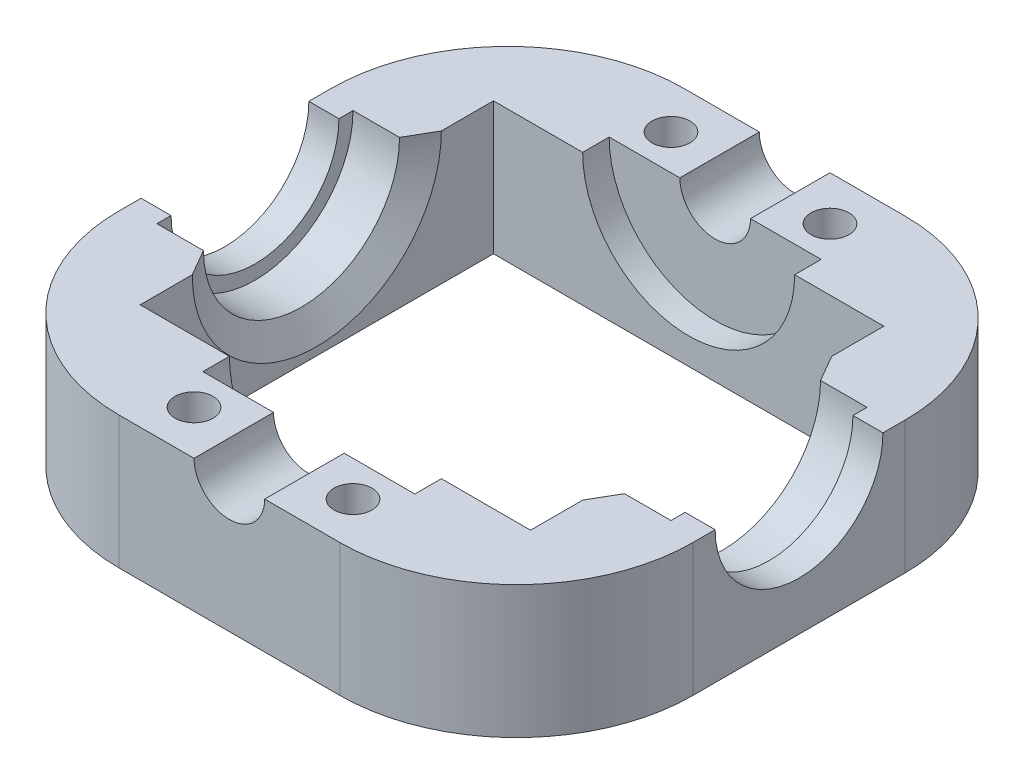
ISO-10303-21;
HEADER;
FILE_DESCRIPTION(('STEP AP214'),'2;1');
FILE_NAME('part.step','',(''),(''),'','','');
FILE_SCHEMA(('AUTOMOTIVE_DESIGN { 1 0 10303 214 1 1 1 1 }'));
ENDSEC;
DATA;
#1=APPLICATION_CONTEXT('core data for automotive mechanical design processes');
#2=APPLICATION_PROTOCOL_DEFINITION('international standard','automotive_design',2000,#1);
#3=PRODUCT_CONTEXT('',#1,'mechanical');
#4=PRODUCT('Part','Part','',(#3));
#5=PRODUCT_RELATED_PRODUCT_CATEGORY('part','',(#4));
#6=PRODUCT_DEFINITION_FORMATION('','',#4);
#7=PRODUCT_DEFINITION_CONTEXT('part definition',#1,'design');
#8=PRODUCT_DEFINITION('design','',#6,#7);
#9=PRODUCT_DEFINITION_SHAPE('','',#8);
#10=(LENGTH_UNIT() NAMED_UNIT(*) SI_UNIT(.MILLI.,.METRE.));
#11=(NAMED_UNIT(*) PLANE_ANGLE_UNIT() SI_UNIT($,.RADIAN.));
#12=(NAMED_UNIT(*) SI_UNIT($,.STERADIAN.) SOLID_ANGLE_UNIT());
#13=UNCERTAINTY_MEASURE_WITH_UNIT(LENGTH_MEASURE(1.E-05),#10,'distance_accuracy_value','');
#14=(GEOMETRIC_REPRESENTATION_CONTEXT(3) GLOBAL_UNCERTAINTY_ASSIGNED_CONTEXT((#13)) GLOBAL_UNIT_ASSIGNED_CONTEXT((#10,
#11,#12)) REPRESENTATION_CONTEXT('',''));
#15=CARTESIAN_POINT('',(0.,0.,0.));
#16=DIRECTION('',(0.,0.,1.));
#17=DIRECTION('',(1.,0.,0.));
#18=AXIS2_PLACEMENT_3D('',#15,#16,#17);
#19=CARTESIAN_POINT('',(0.,15.,0.));
#20=DIRECTION('',(0.,1.,0.));
#21=DIRECTION('',(0.,0.,1.));
#22=AXIS2_PLACEMENT_3D('',#19,#20,#21);
#23=PLANE('',#22);
#24=DIRECTION('',(1.,0.,0.));
#25=VECTOR('',#24,1.);
#26=CARTESIAN_POINT('',(0.,15.,23.));
#27=LINE('',#26,#25);
#28=CARTESIAN_POINT('',(-12.,15.,23.));
#29=VERTEX_POINT('',#28);
#30=CARTESIAN_POINT('',(-4.,15.,23.));
#31=VERTEX_POINT('',#30);
#32=EDGE_CURVE('E57',#29,#31,#27,.T.);
#33=ORIENTED_EDGE('',*,*,#32,.F.);
#34=DIRECTION('',(0.,0.,-1.));
#35=VECTOR('',#34,1.);
#36=CARTESIAN_POINT('',(-12.,15.,-29.8714158950038));
#37=LINE('',#36,#35);
#38=CARTESIAN_POINT('',(-12.,15.,20.));
#39=VERTEX_POINT('',#38);
#40=EDGE_CURVE('E265',#39,#29,#37,.F.);
#41=ORIENTED_EDGE('',*,*,#40,.F.);
#42=DIRECTION('',(1.,0.,0.));
#43=VECTOR('',#42,1.);
#44=CARTESIAN_POINT('',(22.1,15.,20.));
#45=LINE('',#44,#43);
#46=CARTESIAN_POINT('',(-22.1,15.,20.));
#47=VERTEX_POINT('',#46);
#48=EDGE_CURVE('E342',#47,#39,#45,.T.);
#49=ORIENTED_EDGE('',*,*,#48,.F.);
#50=DIRECTION('',(0.,0.,1.));
#51=VECTOR('',#50,1.);
#52=CARTESIAN_POINT('',(-22.1,15.,20.));
#53=LINE('',#52,#51);
#54=CARTESIAN_POINT('',(-22.1,15.,14.1));
#55=VERTEX_POINT('',#54);
#56=EDGE_CURVE('E341',#55,#47,#53,.T.);
#57=ORIENTED_EDGE('',*,*,#56,.F.);
#58=DIRECTION('',(0.499999999999998,0.,0.86602540378444));
#59=VECTOR('',#58,1.);
#60=CARTESIAN_POINT('',(-30.2406387955737,15.,0.));
#61=LINE('',#60,#59);
#62=CARTESIAN_POINT('',(-23.8320508075689,15.,11.1));
#63=VERTEX_POINT('',#62);
#64=EDGE_CURVE('E462',#55,#63,#61,.F.);
#65=ORIENTED_EDGE('',*,*,#64,.T.);
#66=DIRECTION('',(-1.,0.,0.));
#67=VECTOR('',#66,1.);
#68=CARTESIAN_POINT('',(22.1,15.,11.1));
#69=LINE('',#68,#67);
#70=CARTESIAN_POINT('',(-29.0999999999999,15.,11.1));
#71=VERTEX_POINT('',#70);
#72=EDGE_CURVE('E323',#71,#63,#69,.F.);
#73=ORIENTED_EDGE('',*,*,#72,.F.);
#74=DIRECTION('',(0.,0.,1.));
#75=VECTOR('',#74,1.);
#76=CARTESIAN_POINT('',(-29.0999999999999,15.,0.));
#77=LINE('',#76,#75);
#78=CARTESIAN_POINT('',(-29.0999999999999,15.,9.5));
#79=VERTEX_POINT('',#78);
#80=EDGE_CURVE('E403',#79,#71,#77,.T.);
#81=ORIENTED_EDGE('',*,*,#80,.F.);
#82=DIRECTION('',(1.,0.,0.));
#83=VECTOR('',#82,1.);
#84=CARTESIAN_POINT('',(-32.5,15.,9.5));
#85=LINE('',#84,#83);
#86=CARTESIAN_POINT('',(-32.5,15.,9.5));
#87=VERTEX_POINT('',#86);
#88=EDGE_CURVE('E313',#87,#79,#85,.T.);
#89=ORIENTED_EDGE('',*,*,#88,.F.);
#90=DIRECTION('',(0.,0.,1.));
#91=VECTOR('',#90,1.);
#92=CARTESIAN_POINT('',(-32.5,15.,32.));
#93=LINE('',#92,#91);
#94=CARTESIAN_POINT('',(-32.5,15.,12.));
#95=VERTEX_POINT('',#94);
#96=EDGE_CURVE('E377',#87,#95,#93,.T.);
#97=ORIENTED_EDGE('',*,*,#96,.T.);
#98=CARTESIAN_POINT('',(-12.5,15.,12.));
#99=DIRECTION('',(0.,1.,0.));
#100=DIRECTION('',(0.,0.,1.));
#101=AXIS2_PLACEMENT_3D('',#98,#99,#100);
#102=CIRCLE('',#101,20.);
#103=CARTESIAN_POINT('',(-12.5,15.,32.));
#104=VERTEX_POINT('',#103);
#105=EDGE_CURVE('E428',#95,#104,#102,.T.);
#106=ORIENTED_EDGE('',*,*,#105,.T.);
#107=DIRECTION('',(1.,0.,0.));
#108=VECTOR('',#107,1.);
#109=CARTESIAN_POINT('',(32.5,15.,32.));
#110=LINE('',#109,#108);
#111=CARTESIAN_POINT('',(-4.,15.,32.));
#112=VERTEX_POINT('',#111);
#113=EDGE_CURVE('E378',#104,#112,#110,.T.);
#114=ORIENTED_EDGE('',*,*,#113,.T.);
#115=DIRECTION('',(0.,0.,1.));
#116=VECTOR('',#115,1.);
#117=CARTESIAN_POINT('',(-4.,15.,-32.));
#118=LINE('',#117,#116);
#119=EDGE_CURVE('E303',#31,#112,#118,.T.);
#120=ORIENTED_EDGE('',*,*,#119,.F.);
#121=EDGE_LOOP('',(#33,#41,#49,#57,#65,#73,#81,#89,#97,#106,#114,#120));
#122=FACE_BOUND('',#121,.T.);
#123=CARTESIAN_POINT('',(-8.99999999999999,15.,27.));
#124=DIRECTION('',(0.,1.,0.));
#125=DIRECTION('',(0.,0.,1.));
#126=AXIS2_PLACEMENT_3D('',#123,#124,#125);
#127=CIRCLE('',#126,2.15);
#128=CARTESIAN_POINT('',(-8.99999999999999,15.,29.15));
#129=VERTEX_POINT('',#128);
#130=EDGE_CURVE('E278',#129,#129,#127,.T.);
#131=ORIENTED_EDGE('',*,*,#130,.F.);
#132=EDGE_LOOP('',(#131));
#133=FACE_BOUND('',#132,.T.);
#134=ADVANCED_FACE('F35',(#122,#133),#23,.T.);
#135=DIRECTION('',(0.,0.,-1.));
#136=VECTOR('',#135,1.);
#137=CARTESIAN_POINT('',(-12.,15.,-29.8714158950038));
#138=LINE('',#137,#136);
#139=CARTESIAN_POINT('',(-12.,15.,-23.));
#140=VERTEX_POINT('',#139);
#141=CARTESIAN_POINT('',(-12.,15.,-20.));
#142=VERTEX_POINT('',#141);
#143=EDGE_CURVE('E243',#140,#142,#138,.F.);
#144=ORIENTED_EDGE('',*,*,#143,.F.);
#145=DIRECTION('',(-1.,0.,0.));
#146=VECTOR('',#145,1.);
#147=CARTESIAN_POINT('',(0.,15.,-23.));
#148=LINE('',#147,#146);
#149=CARTESIAN_POINT('',(-4.,15.,-23.));
#150=VERTEX_POINT('',#149);
#151=EDGE_CURVE('E231',#150,#140,#148,.T.);
#152=ORIENTED_EDGE('',*,*,#151,.F.);
#153=DIRECTION('',(0.,0.,1.));
#154=VECTOR('',#153,1.);
#155=CARTESIAN_POINT('',(-4.,15.,-32.));
#156=LINE('',#155,#154);
#157=CARTESIAN_POINT('',(-4.,15.,-32.));
#158=VERTEX_POINT('',#157);
#159=EDGE_CURVE('E298',#158,#150,#156,.T.);
#160=ORIENTED_EDGE('',*,*,#159,.F.);
#161=DIRECTION('',(-1.,0.,0.));
#162=VECTOR('',#161,1.);
#163=CARTESIAN_POINT('',(32.5,15.,-32.));
#164=LINE('',#163,#162);
#165=CARTESIAN_POINT('',(-12.5,15.,-32.));
#166=VERTEX_POINT('',#165);
#167=EDGE_CURVE('E384',#158,#166,#164,.T.);
#168=ORIENTED_EDGE('',*,*,#167,.T.);
#169=CARTESIAN_POINT('',(-12.5,15.,-12.));
#170=DIRECTION('',(0.,1.,0.));
#171=DIRECTION('',(0.,0.,1.));
#172=AXIS2_PLACEMENT_3D('',#169,#170,#171);
#173=CIRCLE('',#172,20.);
#174=CARTESIAN_POINT('',(-32.5,15.,-12.));
#175=VERTEX_POINT('',#174);
#176=EDGE_CURVE('E435',#166,#175,#173,.T.);
#177=ORIENTED_EDGE('',*,*,#176,.T.);
#178=CARTESIAN_POINT('',(-32.5,15.,-9.5));
#179=VERTEX_POINT('',#178);
#180=EDGE_CURVE('E374',#175,#179,#93,.T.);
#181=ORIENTED_EDGE('',*,*,#180,.T.);
#182=DIRECTION('',(1.,0.,0.));
#183=VECTOR('',#182,1.);
#184=CARTESIAN_POINT('',(-32.5,15.,-9.5));
#185=LINE('',#184,#183);
#186=CARTESIAN_POINT('',(-29.0999999999999,15.,-9.5));
#187=VERTEX_POINT('',#186);
#188=EDGE_CURVE('E309',#187,#179,#185,.F.);
#189=ORIENTED_EDGE('',*,*,#188,.F.);
#190=CARTESIAN_POINT('',(-29.0999999999999,15.,-11.1));
#191=VERTEX_POINT('',#190);
#192=EDGE_CURVE('E404',#191,#187,#77,.T.);
#193=ORIENTED_EDGE('',*,*,#192,.F.);
#194=DIRECTION('',(-1.,0.,0.));
#195=VECTOR('',#194,1.);
#196=CARTESIAN_POINT('',(22.1,15.,-11.1));
#197=LINE('',#196,#195);
#198=CARTESIAN_POINT('',(-23.8320508075689,15.,-11.1));
#199=VERTEX_POINT('',#198);
#200=EDGE_CURVE('E326',#199,#191,#197,.T.);
#201=ORIENTED_EDGE('',*,*,#200,.F.);
#202=DIRECTION('',(-0.499999999999998,0.,0.86602540378444));
#203=VECTOR('',#202,1.);
#204=CARTESIAN_POINT('',(-30.2406387955737,15.,0.));
#205=LINE('',#204,#203);
#206=CARTESIAN_POINT('',(-22.1,15.,-14.1));
#207=VERTEX_POINT('',#206);
#208=EDGE_CURVE('E458',#199,#207,#205,.F.);
#209=ORIENTED_EDGE('',*,*,#208,.T.);
#210=CARTESIAN_POINT('',(-22.1,15.,-20.));
#211=VERTEX_POINT('',#210);
#212=EDGE_CURVE('E337',#211,#207,#53,.T.);
#213=ORIENTED_EDGE('',*,*,#212,.F.);
#214=DIRECTION('',(-1.,0.,0.));
#215=VECTOR('',#214,1.);
#216=CARTESIAN_POINT('',(22.1,15.,-20.));
#217=LINE('',#216,#215);
#218=EDGE_CURVE('E252',#142,#211,#217,.T.);
#219=ORIENTED_EDGE('',*,*,#218,.F.);
#220=EDGE_LOOP('',(#144,#152,#160,#168,#177,#181,#189,#193,#201,#209,#213,#219));
#221=FACE_BOUND('',#220,.T.);
#222=CARTESIAN_POINT('',(-9.,15.,-27.));
#223=DIRECTION('',(0.,1.,0.));
#224=DIRECTION('',(0.,0.,1.));
#225=AXIS2_PLACEMENT_3D('',#222,#223,#224);
#226=CIRCLE('',#225,2.15);
#227=CARTESIAN_POINT('',(-9.,15.,-24.85));
#228=VERTEX_POINT('',#227);
#229=EDGE_CURVE('E284',#228,#228,#226,.T.);
#230=ORIENTED_EDGE('',*,*,#229,.F.);
#231=EDGE_LOOP('',(#230));
#232=FACE_BOUND('',#231,.T.);
#233=ADVANCED_FACE('F249',(#221,#232),#23,.T.);
#234=DIRECTION('',(1.,0.,0.));
#235=VECTOR('',#234,1.);
#236=CARTESIAN_POINT('',(0.,15.,23.));
#237=LINE('',#236,#235);
#238=CARTESIAN_POINT('',(4.,15.,23.));
#239=VERTEX_POINT('',#238);
#240=CARTESIAN_POINT('',(12.,15.,23.));
#241=VERTEX_POINT('',#240);
#242=EDGE_CURVE('E260',#239,#241,#237,.T.);
#243=ORIENTED_EDGE('',*,*,#242,.F.);
#244=DIRECTION('',(0.,0.,1.));
#245=VECTOR('',#244,1.);
#246=CARTESIAN_POINT('',(4.,15.,-32.));
#247=LINE('',#246,#245);
#248=CARTESIAN_POINT('',(4.,15.,32.));
#249=VERTEX_POINT('',#248);
#250=EDGE_CURVE('E300',#249,#239,#247,.F.);
#251=ORIENTED_EDGE('',*,*,#250,.F.);
#252=CARTESIAN_POINT('',(12.5,15.,32.));
#253=VERTEX_POINT('',#252);
#254=EDGE_CURVE('E376',#249,#253,#110,.T.);
#255=ORIENTED_EDGE('',*,*,#254,.T.);
#256=CARTESIAN_POINT('',(12.5,15.,12.));
#257=DIRECTION('',(0.,1.,0.));
#258=DIRECTION('',(0.,0.,1.));
#259=AXIS2_PLACEMENT_3D('',#256,#257,#258);
#260=CIRCLE('',#259,20.);
#261=CARTESIAN_POINT('',(32.5,15.,12.));
#262=VERTEX_POINT('',#261);
#263=EDGE_CURVE('E444',#253,#262,#260,.T.);
#264=ORIENTED_EDGE('',*,*,#263,.T.);
#265=DIRECTION('',(0.,0.,-1.));
#266=VECTOR('',#265,1.);
#267=CARTESIAN_POINT('',(32.5,15.,32.));
#268=LINE('',#267,#266);
#269=CARTESIAN_POINT('',(32.5,15.,9.5));
#270=VERTEX_POINT('',#269);
#271=EDGE_CURVE('E382',#262,#270,#268,.T.);
#272=ORIENTED_EDGE('',*,*,#271,.T.);
#273=CARTESIAN_POINT('',(29.1,15.,9.5));
#274=VERTEX_POINT('',#273);
#275=EDGE_CURVE('E317',#274,#270,#85,.T.);
#276=ORIENTED_EDGE('',*,*,#275,.F.);
#277=DIRECTION('',(0.,0.,-1.));
#278=VECTOR('',#277,1.);
#279=CARTESIAN_POINT('',(29.1,15.,0.));
#280=LINE('',#279,#278);
#281=CARTESIAN_POINT('',(29.1,15.,11.1));
#282=VERTEX_POINT('',#281);
#283=EDGE_CURVE('E400',#282,#274,#280,.T.);
#284=ORIENTED_EDGE('',*,*,#283,.F.);
#285=DIRECTION('',(-1.,0.,0.));
#286=VECTOR('',#285,1.);
#287=CARTESIAN_POINT('',(22.1,15.,11.1));
#288=LINE('',#287,#286);
#289=CARTESIAN_POINT('',(23.8320508075689,15.,11.1));
#290=VERTEX_POINT('',#289);
#291=EDGE_CURVE('E331',#290,#282,#288,.F.);
#292=ORIENTED_EDGE('',*,*,#291,.F.);
#293=DIRECTION('',(0.499999999999999,0.,-0.866025403784439));
#294=VECTOR('',#293,1.);
#295=CARTESIAN_POINT('',(30.2406387955737,15.,0.));
#296=LINE('',#295,#294);
#297=CARTESIAN_POINT('',(22.1,15.,14.1));
#298=VERTEX_POINT('',#297);
#299=EDGE_CURVE('E449',#290,#298,#296,.F.);
#300=ORIENTED_EDGE('',*,*,#299,.T.);
#301=DIRECTION('',(0.,0.,-1.));
#302=VECTOR('',#301,1.);
#303=CARTESIAN_POINT('',(22.1,15.,20.));
#304=LINE('',#303,#302);
#305=CARTESIAN_POINT('',(22.1,15.,20.));
#306=VERTEX_POINT('',#305);
#307=EDGE_CURVE('E346',#306,#298,#304,.T.);
#308=ORIENTED_EDGE('',*,*,#307,.F.);
#309=CARTESIAN_POINT('',(12.,15.,20.));
#310=VERTEX_POINT('',#309);
#311=EDGE_CURVE('E340',#310,#306,#45,.T.);
#312=ORIENTED_EDGE('',*,*,#311,.F.);
#313=DIRECTION('',(0.,0.,-1.));
#314=VECTOR('',#313,1.);
#315=CARTESIAN_POINT('',(12.,15.,-29.8714158950038));
#316=LINE('',#315,#314);
#317=EDGE_CURVE('E263',#241,#310,#316,.T.);
#318=ORIENTED_EDGE('',*,*,#317,.F.);
#319=EDGE_LOOP('',(#243,#251,#255,#264,#272,#276,#284,#292,#300,#308,#312,#318));
#320=FACE_BOUND('',#319,.T.);
#321=CARTESIAN_POINT('',(9.00000000000001,15.,27.));
#322=DIRECTION('',(0.,1.,0.));
#323=DIRECTION('',(0.,0.,1.));
#324=AXIS2_PLACEMENT_3D('',#321,#322,#323);
#325=CIRCLE('',#324,2.15);
#326=CARTESIAN_POINT('',(9.00000000000001,15.,29.15));
#327=VERTEX_POINT('',#326);
#328=EDGE_CURVE('E272',#327,#327,#325,.T.);
#329=ORIENTED_EDGE('',*,*,#328,.F.);
#330=EDGE_LOOP('',(#329));
#331=FACE_BOUND('',#330,.T.);
#332=ADVANCED_FACE('F481',(#320,#331),#23,.T.);
#333=DIRECTION('',(0.,0.,-1.));
#334=VECTOR('',#333,1.);
#335=CARTESIAN_POINT('',(12.,15.,-29.8714158950038));
#336=LINE('',#335,#334);
#337=CARTESIAN_POINT('',(12.,15.,-20.));
#338=VERTEX_POINT('',#337);
#339=CARTESIAN_POINT('',(12.,15.,-23.));
#340=VERTEX_POINT('',#339);
#341=EDGE_CURVE('E239',#338,#340,#336,.T.);
#342=ORIENTED_EDGE('',*,*,#341,.F.);
#343=CARTESIAN_POINT('',(22.1,15.,-20.));
#344=VERTEX_POINT('',#343);
#345=EDGE_CURVE('E349',#344,#338,#217,.T.);
#346=ORIENTED_EDGE('',*,*,#345,.F.);
#347=CARTESIAN_POINT('',(22.1,15.,-14.1));
#348=VERTEX_POINT('',#347);
#349=EDGE_CURVE('E345',#348,#344,#304,.T.);
#350=ORIENTED_EDGE('',*,*,#349,.F.);
#351=DIRECTION('',(-0.499999999999999,0.,-0.866025403784439));
#352=VECTOR('',#351,1.);
#353=CARTESIAN_POINT('',(30.2406387955737,15.,0.));
#354=LINE('',#353,#352);
#355=CARTESIAN_POINT('',(23.8320508075689,15.,-11.1));
#356=VERTEX_POINT('',#355);
#357=EDGE_CURVE('E453',#348,#356,#354,.F.);
#358=ORIENTED_EDGE('',*,*,#357,.T.);
#359=DIRECTION('',(-1.,0.,0.));
#360=VECTOR('',#359,1.);
#361=CARTESIAN_POINT('',(22.1,15.,-11.1));
#362=LINE('',#361,#360);
#363=CARTESIAN_POINT('',(29.1,15.,-11.1));
#364=VERTEX_POINT('',#363);
#365=EDGE_CURVE('E333',#364,#356,#362,.T.);
#366=ORIENTED_EDGE('',*,*,#365,.F.);
#367=CARTESIAN_POINT('',(29.1,15.,-9.5));
#368=VERTEX_POINT('',#367);
#369=EDGE_CURVE('E388',#368,#364,#280,.T.);
#370=ORIENTED_EDGE('',*,*,#369,.F.);
#371=CARTESIAN_POINT('',(32.5,15.,-9.5));
#372=VERTEX_POINT('',#371);
#373=EDGE_CURVE('E314',#372,#368,#185,.F.);
#374=ORIENTED_EDGE('',*,*,#373,.F.);
#375=CARTESIAN_POINT('',(32.5,15.,-12.));
#376=VERTEX_POINT('',#375);
#377=EDGE_CURVE('E381',#372,#376,#268,.T.);
#378=ORIENTED_EDGE('',*,*,#377,.T.);
#379=CARTESIAN_POINT('',(12.5,15.,-12.));
#380=DIRECTION('',(0.,1.,0.));
#381=DIRECTION('',(0.,0.,1.));
#382=AXIS2_PLACEMENT_3D('',#379,#380,#381);
#383=CIRCLE('',#382,20.);
#384=CARTESIAN_POINT('',(12.5,15.,-32.));
#385=VERTEX_POINT('',#384);
#386=EDGE_CURVE('E442',#376,#385,#383,.T.);
#387=ORIENTED_EDGE('',*,*,#386,.T.);
#388=CARTESIAN_POINT('',(4.,15.,-32.));
#389=VERTEX_POINT('',#388);
#390=EDGE_CURVE('E385',#385,#389,#164,.T.);
#391=ORIENTED_EDGE('',*,*,#390,.T.);
#392=DIRECTION('',(0.,0.,1.));
#393=VECTOR('',#392,1.);
#394=CARTESIAN_POINT('',(4.,15.,-32.));
#395=LINE('',#394,#393);
#396=CARTESIAN_POINT('',(4.,15.,-23.));
#397=VERTEX_POINT('',#396);
#398=EDGE_CURVE('E295',#397,#389,#395,.F.);
#399=ORIENTED_EDGE('',*,*,#398,.F.);
#400=DIRECTION('',(-1.,0.,0.));
#401=VECTOR('',#400,1.);
#402=CARTESIAN_POINT('',(0.,15.,-23.));
#403=LINE('',#402,#401);
#404=EDGE_CURVE('E50',#340,#397,#403,.T.);
#405=ORIENTED_EDGE('',*,*,#404,.F.);
#406=EDGE_LOOP('',(#342,#346,#350,#358,#366,#370,#374,#378,#387,#391,#399,#405));
#407=FACE_BOUND('',#406,.T.);
#408=CARTESIAN_POINT('',(9.,15.,-27.));
#409=DIRECTION('',(0.,1.,0.));
#410=DIRECTION('',(0.,0.,1.));
#411=AXIS2_PLACEMENT_3D('',#408,#409,#410);
#412=CIRCLE('',#411,2.15);
#413=CARTESIAN_POINT('',(9.,15.,-24.85));
#414=VERTEX_POINT('',#413);
#415=EDGE_CURVE('E267',#414,#414,#412,.T.);
#416=ORIENTED_EDGE('',*,*,#415,.F.);
#417=EDGE_LOOP('',(#416));
#418=FACE_BOUND('',#417,.T.);
#419=ADVANCED_FACE('F575',(#407,#418),#23,.T.);
#420=CARTESIAN_POINT('',(0.,0.,0.));
#421=DIRECTION('',(0.,1.,0.));
#422=DIRECTION('',(0.,0.,1.));
#423=AXIS2_PLACEMENT_3D('',#420,#421,#422);
#424=PLANE('',#423);
#425=CARTESIAN_POINT('',(9.,0.,-27.));
#426=DIRECTION('',(0.,1.,0.));
#427=DIRECTION('',(0.,0.,1.));
#428=AXIS2_PLACEMENT_3D('',#425,#426,#427);
#429=CIRCLE('',#428,2.15);
#430=CARTESIAN_POINT('',(9.,0.,-24.85));
#431=VERTEX_POINT('',#430);
#432=EDGE_CURVE('E287',#431,#431,#429,.T.);
#433=ORIENTED_EDGE('',*,*,#432,.T.);
#434=EDGE_LOOP('',(#433));
#435=FACE_BOUND('',#434,.T.);
#436=CARTESIAN_POINT('',(-9.,0.,-27.));
#437=DIRECTION('',(0.,1.,0.));
#438=DIRECTION('',(0.,0.,1.));
#439=AXIS2_PLACEMENT_3D('',#436,#437,#438);
#440=CIRCLE('',#439,2.15);
#441=CARTESIAN_POINT('',(-9.,0.,-24.85));
#442=VERTEX_POINT('',#441);
#443=EDGE_CURVE('E281',#442,#442,#440,.T.);
#444=ORIENTED_EDGE('',*,*,#443,.T.);
#445=EDGE_LOOP('',(#444));
#446=FACE_BOUND('',#445,.T.);
#447=CARTESIAN_POINT('',(-8.99999999999999,0.,27.));
#448=DIRECTION('',(0.,1.,0.));
#449=DIRECTION('',(0.,0.,1.));
#450=AXIS2_PLACEMENT_3D('',#447,#448,#449);
#451=CIRCLE('',#450,2.15);
#452=CARTESIAN_POINT('',(-8.99999999999999,0.,29.15));
#453=VERTEX_POINT('',#452);
#454=EDGE_CURVE('E275',#453,#453,#451,.T.);
#455=ORIENTED_EDGE('',*,*,#454,.T.);
#456=EDGE_LOOP('',(#455));
#457=FACE_BOUND('',#456,.T.);
#458=CARTESIAN_POINT('',(9.00000000000001,0.,27.));
#459=DIRECTION('',(0.,1.,0.));
#460=DIRECTION('',(0.,0.,1.));
#461=AXIS2_PLACEMENT_3D('',#458,#459,#460);
#462=CIRCLE('',#461,2.15);
#463=CARTESIAN_POINT('',(9.00000000000001,0.,29.15));
#464=VERTEX_POINT('',#463);
#465=EDGE_CURVE('E268',#464,#464,#462,.T.);
#466=ORIENTED_EDGE('',*,*,#465,.T.);
#467=EDGE_LOOP('',(#466));
#468=FACE_BOUND('',#467,.T.);
#469=DIRECTION('',(1.,0.,0.));
#470=VECTOR('',#469,1.);
#471=CARTESIAN_POINT('',(32.5,0.,32.));
#472=LINE('',#471,#470);
#473=CARTESIAN_POINT('',(-12.5,0.,32.));
#474=VERTEX_POINT('',#473);
#475=CARTESIAN_POINT('',(12.5,0.,32.));
#476=VERTEX_POINT('',#475);
#477=EDGE_CURVE('E391',#474,#476,#472,.T.);
#478=ORIENTED_EDGE('',*,*,#477,.F.);
#479=CARTESIAN_POINT('',(-12.5,0.,12.));
#480=DIRECTION('',(0.,1.,0.));
#481=DIRECTION('',(0.,0.,1.));
#482=AXIS2_PLACEMENT_3D('',#479,#480,#481);
#483=CIRCLE('',#482,20.);
#484=CARTESIAN_POINT('',(-32.5,0.,12.));
#485=VERTEX_POINT('',#484);
#486=EDGE_CURVE('E421',#474,#485,#483,.F.);
#487=ORIENTED_EDGE('',*,*,#486,.T.);
#488=DIRECTION('',(0.,0.,1.));
#489=VECTOR('',#488,1.);
#490=CARTESIAN_POINT('',(-32.5,0.,32.));
#491=LINE('',#490,#489);
#492=CARTESIAN_POINT('',(-32.5,0.,-12.));
#493=VERTEX_POINT('',#492);
#494=EDGE_CURVE('E373',#493,#485,#491,.T.);
#495=ORIENTED_EDGE('',*,*,#494,.F.);
#496=CARTESIAN_POINT('',(-12.5,0.,-12.));
#497=DIRECTION('',(0.,1.,0.));
#498=DIRECTION('',(0.,0.,1.));
#499=AXIS2_PLACEMENT_3D('',#496,#497,#498);
#500=CIRCLE('',#499,20.);
#501=CARTESIAN_POINT('',(-12.5,0.,-32.));
#502=VERTEX_POINT('',#501);
#503=EDGE_CURVE('E419',#493,#502,#500,.F.);
#504=ORIENTED_EDGE('',*,*,#503,.T.);
#505=DIRECTION('',(-1.,0.,0.));
#506=VECTOR('',#505,1.);
#507=CARTESIAN_POINT('',(32.5,0.,-32.));
#508=LINE('',#507,#506);
#509=CARTESIAN_POINT('',(12.5,0.,-32.));
#510=VERTEX_POINT('',#509);
#511=EDGE_CURVE('E397',#510,#502,#508,.T.);
#512=ORIENTED_EDGE('',*,*,#511,.F.);
#513=CARTESIAN_POINT('',(12.5,0.,-12.));
#514=DIRECTION('',(0.,1.,0.));
#515=DIRECTION('',(0.,0.,1.));
#516=AXIS2_PLACEMENT_3D('',#513,#514,#515);
#517=CIRCLE('',#516,20.);
#518=CARTESIAN_POINT('',(32.5,0.,-12.));
#519=VERTEX_POINT('',#518);
#520=EDGE_CURVE('E417',#510,#519,#517,.F.);
#521=ORIENTED_EDGE('',*,*,#520,.T.);
#522=DIRECTION('',(0.,0.,-1.));
#523=VECTOR('',#522,1.);
#524=CARTESIAN_POINT('',(32.5,0.,32.));
#525=LINE('',#524,#523);
#526=CARTESIAN_POINT('',(32.5,0.,12.));
#527=VERTEX_POINT('',#526);
#528=EDGE_CURVE('E394',#527,#519,#525,.T.);
#529=ORIENTED_EDGE('',*,*,#528,.F.);
#530=CARTESIAN_POINT('',(12.5,0.,12.));
#531=DIRECTION('',(0.,1.,0.));
#532=DIRECTION('',(0.,0.,1.));
#533=AXIS2_PLACEMENT_3D('',#530,#531,#532);
#534=CIRCLE('',#533,20.);
#535=EDGE_CURVE('E415',#527,#476,#534,.F.);
#536=ORIENTED_EDGE('',*,*,#535,.T.);
#537=EDGE_LOOP('',(#478,#487,#495,#504,#512,#521,#529,#536));
#538=FACE_BOUND('',#537,.T.);
#539=DIRECTION('',(0.,0.,1.));
#540=VECTOR('',#539,1.);
#541=CARTESIAN_POINT('',(-22.1,0.,20.));
#542=LINE('',#541,#540);
#543=CARTESIAN_POINT('',(-22.1,0.,-20.));
#544=VERTEX_POINT('',#543);
#545=CARTESIAN_POINT('',(-22.1,0.,20.));
#546=VERTEX_POINT('',#545);
#547=EDGE_CURVE('E336',#544,#546,#542,.T.);
#548=ORIENTED_EDGE('',*,*,#547,.T.);
#549=DIRECTION('',(1.,0.,0.));
#550=VECTOR('',#549,1.);
#551=CARTESIAN_POINT('',(22.1,0.,20.));
#552=LINE('',#551,#550);
#553=CARTESIAN_POINT('',(22.1,0.,20.));
#554=VERTEX_POINT('',#553);
#555=EDGE_CURVE('E355',#546,#554,#552,.T.);
#556=ORIENTED_EDGE('',*,*,#555,.T.);
#557=DIRECTION('',(0.,0.,-1.));
#558=VECTOR('',#557,1.);
#559=CARTESIAN_POINT('',(22.1,0.,20.));
#560=LINE('',#559,#558);
#561=CARTESIAN_POINT('',(22.1,0.,-20.));
#562=VERTEX_POINT('',#561);
#563=EDGE_CURVE('E358',#554,#562,#560,.T.);
#564=ORIENTED_EDGE('',*,*,#563,.T.);
#565=DIRECTION('',(-1.,0.,0.));
#566=VECTOR('',#565,1.);
#567=CARTESIAN_POINT('',(22.1,0.,-20.));
#568=LINE('',#567,#566);
#569=EDGE_CURVE('E361',#562,#544,#568,.T.);
#570=ORIENTED_EDGE('',*,*,#569,.T.);
#571=EDGE_LOOP('',(#548,#556,#564,#570));
#572=FACE_BOUND('',#571,.T.);
#573=ADVANCED_FACE('F500',(#435,#446,#457,#468,#538,#572),#424,.F.);
#574=CARTESIAN_POINT('',(-32.5,15.,32.));
#575=DIRECTION('',(1.,0.,0.));
#576=DIRECTION('',(0.,0.,-1.));
#577=AXIS2_PLACEMENT_3D('',#574,#575,#576);
#578=PLANE('',#577);
#579=ORIENTED_EDGE('',*,*,#494,.T.);
#580=DIRECTION('',(0.,-1.,0.));
#581=VECTOR('',#580,1.);
#582=CARTESIAN_POINT('',(-32.5,15.,12.));
#583=LINE('',#582,#581);
#584=EDGE_CURVE('E426',#485,#95,#583,.F.);
#585=ORIENTED_EDGE('',*,*,#584,.T.);
#586=ORIENTED_EDGE('',*,*,#96,.F.);
#587=CARTESIAN_POINT('',(-32.5,15.,0.));
#588=DIRECTION('',(1.,0.,0.));
#589=DIRECTION('',(0.,0.,-1.));
#590=AXIS2_PLACEMENT_3D('',#587,#588,#589);
#591=CIRCLE('',#590,9.5);
#592=EDGE_CURVE('E306',#87,#179,#591,.T.);
#593=ORIENTED_EDGE('',*,*,#592,.T.);
#594=ORIENTED_EDGE('',*,*,#180,.F.);
#595=DIRECTION('',(0.,-1.,0.));
#596=VECTOR('',#595,1.);
#597=CARTESIAN_POINT('',(-32.5,15.,-12.));
#598=LINE('',#597,#596);
#599=EDGE_CURVE('E423',#175,#493,#598,.T.);
#600=ORIENTED_EDGE('',*,*,#599,.T.);
#601=EDGE_LOOP('',(#579,#585,#586,#593,#594,#600));
#602=FACE_BOUND('',#601,.T.);
#603=ADVANCED_FACE('F530',(#602),#578,.F.);
#604=CARTESIAN_POINT('',(32.5,15.,32.));
#605=DIRECTION('',(0.,0.,-1.));
#606=DIRECTION('',(-1.,0.,0.));
#607=AXIS2_PLACEMENT_3D('',#604,#605,#606);
#608=PLANE('',#607);
#609=ORIENTED_EDGE('',*,*,#113,.F.);
#610=DIRECTION('',(0.,-1.,0.));
#611=VECTOR('',#610,1.);
#612=CARTESIAN_POINT('',(-12.5,15.,32.));
#613=LINE('',#612,#611);
#614=EDGE_CURVE('E412',#104,#474,#613,.T.);
#615=ORIENTED_EDGE('',*,*,#614,.T.);
#616=ORIENTED_EDGE('',*,*,#477,.T.);
#617=DIRECTION('',(0.,-1.,0.));
#618=VECTOR('',#617,1.);
#619=CARTESIAN_POINT('',(12.5,15.,32.));
#620=LINE('',#619,#618);
#621=EDGE_CURVE('E410',#476,#253,#620,.F.);
#622=ORIENTED_EDGE('',*,*,#621,.T.);
#623=ORIENTED_EDGE('',*,*,#254,.F.);
#624=CARTESIAN_POINT('',(0.,15.,32.));
#625=DIRECTION('',(0.,0.,1.));
#626=DIRECTION('',(1.,0.,0.));
#627=AXIS2_PLACEMENT_3D('',#624,#625,#626);
#628=CIRCLE('',#627,4.);
#629=EDGE_CURVE('E271',#112,#249,#628,.T.);
#630=ORIENTED_EDGE('',*,*,#629,.F.);
#631=EDGE_LOOP('',(#609,#615,#616,#622,#623,#630));
#632=FACE_BOUND('',#631,.T.);
#633=ADVANCED_FACE('F478',(#632),#608,.F.);
#634=CARTESIAN_POINT('',(32.5,15.,32.));
#635=DIRECTION('',(-1.,0.,0.));
#636=DIRECTION('',(0.,0.,1.));
#637=AXIS2_PLACEMENT_3D('',#634,#635,#636);
#638=PLANE('',#637);
#639=ORIENTED_EDGE('',*,*,#528,.T.);
#640=DIRECTION('',(0.,-1.,0.));
#641=VECTOR('',#640,1.);
#642=CARTESIAN_POINT('',(32.5,15.,-12.));
#643=LINE('',#642,#641);
#644=EDGE_CURVE('E440',#519,#376,#643,.F.);
#645=ORIENTED_EDGE('',*,*,#644,.T.);
#646=ORIENTED_EDGE('',*,*,#377,.F.);
#647=CARTESIAN_POINT('',(32.5,15.,0.));
#648=DIRECTION('',(1.,0.,0.));
#649=DIRECTION('',(0.,0.,-1.));
#650=AXIS2_PLACEMENT_3D('',#647,#648,#649);
#651=CIRCLE('',#650,9.5);
#652=EDGE_CURVE('E305',#270,#372,#651,.T.);
#653=ORIENTED_EDGE('',*,*,#652,.F.);
#654=ORIENTED_EDGE('',*,*,#271,.F.);
#655=DIRECTION('',(0.,-1.,0.));
#656=VECTOR('',#655,1.);
#657=CARTESIAN_POINT('',(32.5,15.,12.));
#658=LINE('',#657,#656);
#659=EDGE_CURVE('E437',#262,#527,#658,.T.);
#660=ORIENTED_EDGE('',*,*,#659,.T.);
#661=EDGE_LOOP('',(#639,#645,#646,#653,#654,#660));
#662=FACE_BOUND('',#661,.T.);
#663=ADVANCED_FACE('F549',(#662),#638,.F.);
#664=CARTESIAN_POINT('',(32.5,15.,-32.));
#665=DIRECTION('',(0.,0.,1.));
#666=DIRECTION('',(1.,0.,0.));
#667=AXIS2_PLACEMENT_3D('',#664,#665,#666);
#668=PLANE('',#667);
#669=ORIENTED_EDGE('',*,*,#511,.T.);
#670=DIRECTION('',(0.,-1.,0.));
#671=VECTOR('',#670,1.);
#672=CARTESIAN_POINT('',(-12.5,15.,-32.));
#673=LINE('',#672,#671);
#674=EDGE_CURVE('E433',#502,#166,#673,.F.);
#675=ORIENTED_EDGE('',*,*,#674,.T.);
#676=ORIENTED_EDGE('',*,*,#167,.F.);
#677=CARTESIAN_POINT('',(0.,15.,-32.));
#678=DIRECTION('',(0.,0.,1.));
#679=DIRECTION('',(1.,0.,0.));
#680=AXIS2_PLACEMENT_3D('',#677,#678,#679);
#681=CIRCLE('',#680,4.);
#682=EDGE_CURVE('E292',#158,#389,#681,.T.);
#683=ORIENTED_EDGE('',*,*,#682,.T.);
#684=ORIENTED_EDGE('',*,*,#390,.F.);
#685=DIRECTION('',(0.,-1.,0.));
#686=VECTOR('',#685,1.);
#687=CARTESIAN_POINT('',(12.5,15.,-32.));
#688=LINE('',#687,#686);
#689=EDGE_CURVE('E430',#385,#510,#688,.T.);
#690=ORIENTED_EDGE('',*,*,#689,.T.);
#691=EDGE_LOOP('',(#669,#675,#676,#683,#684,#690));
#692=FACE_BOUND('',#691,.T.);
#693=ADVANCED_FACE('F539',(#692),#668,.F.);
#694=CARTESIAN_POINT('',(-22.1,15.,20.));
#695=DIRECTION('',(1.,0.,0.));
#696=DIRECTION('',(0.,0.,-1.));
#697=AXIS2_PLACEMENT_3D('',#694,#695,#696);
#698=PLANE('',#697);
#699=ORIENTED_EDGE('',*,*,#212,.T.);
#700=CARTESIAN_POINT('',(-22.1,15.,0.));
#701=DIRECTION('',(1.,0.,0.));
#702=DIRECTION('',(0.,0.,-1.));
#703=AXIS2_PLACEMENT_3D('',#700,#701,#702);
#704=CIRCLE('',#703,14.1);
#705=EDGE_CURVE('E460',#207,#55,#704,.F.);
#706=ORIENTED_EDGE('',*,*,#705,.T.);
#707=ORIENTED_EDGE('',*,*,#56,.T.);
#708=DIRECTION('',(0.,-1.,0.));
#709=VECTOR('',#708,1.);
#710=CARTESIAN_POINT('',(-22.1,15.,20.));
#711=LINE('',#710,#709);
#712=EDGE_CURVE('E370',#47,#546,#711,.T.);
#713=ORIENTED_EDGE('',*,*,#712,.T.);
#714=ORIENTED_EDGE('',*,*,#547,.F.);
#715=DIRECTION('',(0.,-1.,0.));
#716=VECTOR('',#715,1.);
#717=CARTESIAN_POINT('',(-22.1,15.,-20.));
#718=LINE('',#717,#716);
#719=EDGE_CURVE('E352',#211,#544,#718,.T.);
#720=ORIENTED_EDGE('',*,*,#719,.F.);
#721=EDGE_LOOP('',(#699,#706,#707,#713,#714,#720));
#722=FACE_BOUND('',#721,.T.);
#723=ADVANCED_FACE('F497',(#722),#698,.T.);
#724=CARTESIAN_POINT('',(22.1,15.,20.));
#725=DIRECTION('',(0.,0.,-1.));
#726=DIRECTION('',(-1.,0.,0.));
#727=AXIS2_PLACEMENT_3D('',#724,#725,#726);
#728=PLANE('',#727);
#729=CARTESIAN_POINT('',(0.,15.,20.));
#730=DIRECTION('',(0.,0.,-1.));
#731=DIRECTION('',(-1.,0.,0.));
#732=AXIS2_PLACEMENT_3D('',#729,#730,#731);
#733=CIRCLE('',#732,12.);
#734=EDGE_CURVE('E253',#310,#39,#733,.T.);
#735=ORIENTED_EDGE('',*,*,#734,.F.);
#736=ORIENTED_EDGE('',*,*,#311,.T.);
#737=DIRECTION('',(0.,-1.,0.));
#738=VECTOR('',#737,1.);
#739=CARTESIAN_POINT('',(22.1,15.,20.));
#740=LINE('',#739,#738);
#741=EDGE_CURVE('E368',#306,#554,#740,.T.);
#742=ORIENTED_EDGE('',*,*,#741,.T.);
#743=ORIENTED_EDGE('',*,*,#555,.F.);
#744=ORIENTED_EDGE('',*,*,#712,.F.);
#745=ORIENTED_EDGE('',*,*,#48,.T.);
#746=EDGE_LOOP('',(#735,#736,#742,#743,#744,#745));
#747=FACE_BOUND('',#746,.T.);
#748=ADVANCED_FACE('F495',(#747),#728,.T.);
#749=CARTESIAN_POINT('',(22.1,15.,20.));
#750=DIRECTION('',(-1.,0.,0.));
#751=DIRECTION('',(0.,0.,1.));
#752=AXIS2_PLACEMENT_3D('',#749,#750,#751);
#753=PLANE('',#752);
#754=ORIENTED_EDGE('',*,*,#307,.T.);
#755=CARTESIAN_POINT('',(22.1,15.,0.));
#756=DIRECTION('',(-1.,0.,0.));
#757=DIRECTION('',(0.,0.,1.));
#758=AXIS2_PLACEMENT_3D('',#755,#756,#757);
#759=CIRCLE('',#758,14.1);
#760=EDGE_CURVE('E451',#298,#348,#759,.F.);
#761=ORIENTED_EDGE('',*,*,#760,.T.);
#762=ORIENTED_EDGE('',*,*,#349,.T.);
#763=DIRECTION('',(0.,-1.,0.));
#764=VECTOR('',#763,1.);
#765=CARTESIAN_POINT('',(22.1,15.,-20.));
#766=LINE('',#765,#764);
#767=EDGE_CURVE('E366',#344,#562,#766,.T.);
#768=ORIENTED_EDGE('',*,*,#767,.T.);
#769=ORIENTED_EDGE('',*,*,#563,.F.);
#770=ORIENTED_EDGE('',*,*,#741,.F.);
#771=EDGE_LOOP('',(#754,#761,#762,#768,#769,#770));
#772=FACE_BOUND('',#771,.T.);
#773=ADVANCED_FACE('F624',(#772),#753,.T.);
#774=CARTESIAN_POINT('',(22.1,15.,-20.));
#775=DIRECTION('',(0.,0.,1.));
#776=DIRECTION('',(1.,0.,0.));
#777=AXIS2_PLACEMENT_3D('',#774,#775,#776);
#778=PLANE('',#777);
#779=CARTESIAN_POINT('',(0.,15.,-20.));
#780=DIRECTION('',(0.,0.,-1.));
#781=DIRECTION('',(-1.,0.,0.));
#782=AXIS2_PLACEMENT_3D('',#779,#780,#781);
#783=CIRCLE('',#782,12.);
#784=EDGE_CURVE('E246',#338,#142,#783,.T.);
#785=ORIENTED_EDGE('',*,*,#784,.T.);
#786=ORIENTED_EDGE('',*,*,#218,.T.);
#787=ORIENTED_EDGE('',*,*,#719,.T.);
#788=ORIENTED_EDGE('',*,*,#569,.F.);
#789=ORIENTED_EDGE('',*,*,#767,.F.);
#790=ORIENTED_EDGE('',*,*,#345,.T.);
#791=EDGE_LOOP('',(#785,#786,#787,#788,#789,#790));
#792=FACE_BOUND('',#791,.T.);
#793=ADVANCED_FACE('F505',(#792),#778,.T.);
#794=CARTESIAN_POINT('',(29.1,15.,11.1));
#795=DIRECTION('',(1.,0.,0.));
#796=DIRECTION('',(0.,0.,-1.));
#797=AXIS2_PLACEMENT_3D('',#794,#795,#796);
#798=PLANE('',#797);
#799=ORIENTED_EDGE('',*,*,#283,.T.);
#800=CARTESIAN_POINT('',(29.1,15.,0.));
#801=DIRECTION('',(1.,0.,0.));
#802=DIRECTION('',(0.,0.,-1.));
#803=AXIS2_PLACEMENT_3D('',#800,#801,#802);
#804=CIRCLE('',#803,9.5);
#805=EDGE_CURVE('E316',#274,#368,#804,.T.);
#806=ORIENTED_EDGE('',*,*,#805,.T.);
#807=ORIENTED_EDGE('',*,*,#369,.T.);
#808=CARTESIAN_POINT('',(29.1,15.,0.));
#809=DIRECTION('',(-1.,0.,0.));
#810=DIRECTION('',(0.,0.,1.));
#811=AXIS2_PLACEMENT_3D('',#808,#809,#810);
#812=CIRCLE('',#811,11.1);
#813=EDGE_CURVE('E328',#364,#282,#812,.T.);
#814=ORIENTED_EDGE('',*,*,#813,.T.);
#815=EDGE_LOOP('',(#799,#806,#807,#814));
#816=FACE_BOUND('',#815,.T.);
#817=ADVANCED_FACE('F617',(#816),#798,.F.);
#818=CARTESIAN_POINT('',(22.1,15.,0.));
#819=DIRECTION('',(-1.,0.,0.));
#820=DIRECTION('',(0.,0.,1.));
#821=AXIS2_PLACEMENT_3D('',#818,#819,#820);
#822=CYLINDRICAL_SURFACE('',#821,11.1);
#823=ORIENTED_EDGE('',*,*,#365,.T.);
#824=CARTESIAN_POINT('',(23.8320508075689,15.,0.));
#825=DIRECTION('',(-1.,0.,0.));
#826=DIRECTION('',(0.,0.,1.));
#827=AXIS2_PLACEMENT_3D('',#824,#825,#826);
#828=CIRCLE('',#827,11.1);
#829=EDGE_CURVE('E446',#356,#290,#828,.T.);
#830=ORIENTED_EDGE('',*,*,#829,.T.);
#831=ORIENTED_EDGE('',*,*,#291,.T.);
#832=ORIENTED_EDGE('',*,*,#813,.F.);
#833=EDGE_LOOP('',(#823,#830,#831,#832));
#834=FACE_BOUND('',#833,.T.);
#835=ADVANCED_FACE('F614',(#834),#822,.F.);
#836=CARTESIAN_POINT('',(22.1,15.,0.));
#837=DIRECTION('',(-1.,0.,0.));
#838=DIRECTION('',(0.,0.,1.));
#839=AXIS2_PLACEMENT_3D('',#836,#837,#838);
#840=CYLINDRICAL_SURFACE('',#839,11.1);
#841=ORIENTED_EDGE('',*,*,#72,.T.);
#842=CARTESIAN_POINT('',(-23.8320508075689,15.,0.));
#843=DIRECTION('',(1.,0.,0.));
#844=DIRECTION('',(0.,0.,-1.));
#845=AXIS2_PLACEMENT_3D('',#842,#843,#844);
#846=CIRCLE('',#845,11.1);
#847=EDGE_CURVE('E455',#63,#199,#846,.T.);
#848=ORIENTED_EDGE('',*,*,#847,.T.);
#849=ORIENTED_EDGE('',*,*,#200,.T.);
#850=CARTESIAN_POINT('',(-29.0999999999999,15.,0.));
#851=DIRECTION('',(-1.,0.,0.));
#852=DIRECTION('',(0.,0.,1.));
#853=AXIS2_PLACEMENT_3D('',#850,#851,#852);
#854=CIRCLE('',#853,11.1);
#855=EDGE_CURVE('E320',#191,#71,#854,.T.);
#856=ORIENTED_EDGE('',*,*,#855,.T.);
#857=EDGE_LOOP('',(#841,#848,#849,#856));
#858=FACE_BOUND('',#857,.T.);
#859=ADVANCED_FACE('F514',(#858),#840,.F.);
#860=CARTESIAN_POINT('',(-29.0999999999999,15.,11.1));
#861=DIRECTION('',(-1.,0.,0.));
#862=DIRECTION('',(0.,0.,1.));
#863=AXIS2_PLACEMENT_3D('',#860,#861,#862);
#864=PLANE('',#863);
#865=ORIENTED_EDGE('',*,*,#192,.T.);
#866=CARTESIAN_POINT('',(-29.0999999999999,15.,0.));
#867=DIRECTION('',(-1.,0.,0.));
#868=DIRECTION('',(0.,0.,1.));
#869=AXIS2_PLACEMENT_3D('',#866,#867,#868);
#870=CIRCLE('',#869,9.5);
#871=EDGE_CURVE('E407',#187,#79,#870,.T.);
#872=ORIENTED_EDGE('',*,*,#871,.T.);
#873=ORIENTED_EDGE('',*,*,#80,.T.);
#874=ORIENTED_EDGE('',*,*,#855,.F.);
#875=EDGE_LOOP('',(#865,#872,#873,#874));
#876=FACE_BOUND('',#875,.T.);
#877=ADVANCED_FACE('F521',(#876),#864,.F.);
#878=CARTESIAN_POINT('',(-32.5,15.,0.));
#879=DIRECTION('',(1.,0.,0.));
#880=DIRECTION('',(0.,0.,-1.));
#881=AXIS2_PLACEMENT_3D('',#878,#879,#880);
#882=CYLINDRICAL_SURFACE('',#881,9.5);
#883=ORIENTED_EDGE('',*,*,#88,.T.);
#884=ORIENTED_EDGE('',*,*,#871,.F.);
#885=ORIENTED_EDGE('',*,*,#188,.T.);
#886=ORIENTED_EDGE('',*,*,#592,.F.);
#887=EDGE_LOOP('',(#883,#884,#885,#886));
#888=FACE_BOUND('',#887,.T.);
#889=ADVANCED_FACE('F524',(#888),#882,.F.);
#890=ORIENTED_EDGE('',*,*,#275,.T.);
#891=ORIENTED_EDGE('',*,*,#652,.T.);
#892=ORIENTED_EDGE('',*,*,#373,.T.);
#893=ORIENTED_EDGE('',*,*,#805,.F.);
#894=EDGE_LOOP('',(#890,#891,#892,#893));
#895=FACE_BOUND('',#894,.T.);
#896=ADVANCED_FACE('F598',(#895),#882,.F.);
#897=CARTESIAN_POINT('',(0.,15.,-32.));
#898=DIRECTION('',(0.,0.,1.));
#899=DIRECTION('',(1.,0.,0.));
#900=AXIS2_PLACEMENT_3D('',#897,#898,#899);
#901=CYLINDRICAL_SURFACE('',#900,4.);
#902=ORIENTED_EDGE('',*,*,#159,.T.);
#903=CARTESIAN_POINT('',(0.,15.,-23.));
#904=DIRECTION('',(0.,0.,-1.));
#905=DIRECTION('',(-1.,0.,0.));
#906=AXIS2_PLACEMENT_3D('',#903,#904,#905);
#907=CIRCLE('',#906,4.);
#908=EDGE_CURVE('E11',#150,#397,#907,.F.);
#909=ORIENTED_EDGE('',*,*,#908,.T.);
#910=ORIENTED_EDGE('',*,*,#398,.T.);
#911=ORIENTED_EDGE('',*,*,#682,.F.);
#912=EDGE_LOOP('',(#902,#909,#910,#911));
#913=FACE_BOUND('',#912,.T.);
#914=ADVANCED_FACE('F596',(#913),#901,.F.);
#915=ORIENTED_EDGE('',*,*,#250,.T.);
#916=CARTESIAN_POINT('',(0.,15.,23.));
#917=DIRECTION('',(0.,0.,1.));
#918=DIRECTION('',(1.,0.,0.));
#919=AXIS2_PLACEMENT_3D('',#916,#917,#918);
#920=CIRCLE('',#919,4.);
#921=EDGE_CURVE('E43',#239,#31,#920,.F.);
#922=ORIENTED_EDGE('',*,*,#921,.T.);
#923=ORIENTED_EDGE('',*,*,#119,.T.);
#924=ORIENTED_EDGE('',*,*,#629,.T.);
#925=EDGE_LOOP('',(#915,#922,#923,#924));
#926=FACE_BOUND('',#925,.T.);
#927=ADVANCED_FACE('F465',(#926),#901,.F.);
#928=CARTESIAN_POINT('',(9.00000000000001,0.,27.));
#929=DIRECTION('',(0.,1.,0.));
#930=DIRECTION('',(0.,0.,1.));
#931=AXIS2_PLACEMENT_3D('',#928,#929,#930);
#932=CYLINDRICAL_SURFACE('',#931,2.15);
#933=ORIENTED_EDGE('',*,*,#465,.F.);
#934=EDGE_LOOP('',(#933));
#935=FACE_BOUND('',#934,.T.);
#936=ORIENTED_EDGE('',*,*,#328,.T.);
#937=EDGE_LOOP('',(#936));
#938=FACE_BOUND('',#937,.T.);
#939=ADVANCED_FACE('F604',(#935,#938),#932,.F.);
#940=CARTESIAN_POINT('',(-8.99999999999999,0.,27.));
#941=DIRECTION('',(0.,1.,0.));
#942=DIRECTION('',(0.,0.,1.));
#943=AXIS2_PLACEMENT_3D('',#940,#941,#942);
#944=CYLINDRICAL_SURFACE('',#943,2.15);
#945=ORIENTED_EDGE('',*,*,#454,.F.);
#946=EDGE_LOOP('',(#945));
#947=FACE_BOUND('',#946,.T.);
#948=ORIENTED_EDGE('',*,*,#130,.T.);
#949=EDGE_LOOP('',(#948));
#950=FACE_BOUND('',#949,.T.);
#951=ADVANCED_FACE('F809',(#947,#950),#944,.F.);
#952=CARTESIAN_POINT('',(-9.,0.,-27.));
#953=DIRECTION('',(0.,1.,0.));
#954=DIRECTION('',(0.,0.,1.));
#955=AXIS2_PLACEMENT_3D('',#952,#953,#954);
#956=CYLINDRICAL_SURFACE('',#955,2.15);
#957=ORIENTED_EDGE('',*,*,#443,.F.);
#958=EDGE_LOOP('',(#957));
#959=FACE_BOUND('',#958,.T.);
#960=ORIENTED_EDGE('',*,*,#229,.T.);
#961=EDGE_LOOP('',(#960));
#962=FACE_BOUND('',#961,.T.);
#963=ADVANCED_FACE('F569',(#959,#962),#956,.F.);
#964=CARTESIAN_POINT('',(9.,0.,-27.));
#965=DIRECTION('',(0.,1.,0.));
#966=DIRECTION('',(0.,0.,1.));
#967=AXIS2_PLACEMENT_3D('',#964,#965,#966);
#968=CYLINDRICAL_SURFACE('',#967,2.15);
#969=ORIENTED_EDGE('',*,*,#432,.F.);
#970=EDGE_LOOP('',(#969));
#971=FACE_BOUND('',#970,.T.);
#972=ORIENTED_EDGE('',*,*,#415,.T.);
#973=EDGE_LOOP('',(#972));
#974=FACE_BOUND('',#973,.T.);
#975=ADVANCED_FACE('F562',(#971,#974),#968,.F.);
#976=CARTESIAN_POINT('',(-12.5,15.,12.));
#977=DIRECTION('',(0.,-1.,0.));
#978=DIRECTION('',(0.,0.,-1.));
#979=AXIS2_PLACEMENT_3D('',#976,#977,#978);
#980=CYLINDRICAL_SURFACE('',#979,20.);
#981=ORIENTED_EDGE('',*,*,#105,.F.);
#982=ORIENTED_EDGE('',*,*,#584,.F.);
#983=ORIENTED_EDGE('',*,*,#486,.F.);
#984=ORIENTED_EDGE('',*,*,#614,.F.);
#985=EDGE_LOOP('',(#981,#982,#983,#984));
#986=FACE_BOUND('',#985,.T.);
#987=ADVANCED_FACE('F559',(#986),#980,.T.);
#988=CARTESIAN_POINT('',(-12.5,15.,-12.));
#989=DIRECTION('',(0.,-1.,0.));
#990=DIRECTION('',(0.,0.,-1.));
#991=AXIS2_PLACEMENT_3D('',#988,#989,#990);
#992=CYLINDRICAL_SURFACE('',#991,20.);
#993=ORIENTED_EDGE('',*,*,#176,.F.);
#994=ORIENTED_EDGE('',*,*,#674,.F.);
#995=ORIENTED_EDGE('',*,*,#503,.F.);
#996=ORIENTED_EDGE('',*,*,#599,.F.);
#997=EDGE_LOOP('',(#993,#994,#995,#996));
#998=FACE_BOUND('',#997,.T.);
#999=ADVANCED_FACE('F533',(#998),#992,.T.);
#1000=CARTESIAN_POINT('',(12.5,15.,-12.));
#1001=DIRECTION('',(0.,-1.,0.));
#1002=DIRECTION('',(0.,0.,-1.));
#1003=AXIS2_PLACEMENT_3D('',#1000,#1001,#1002);
#1004=CYLINDRICAL_SURFACE('',#1003,20.);
#1005=ORIENTED_EDGE('',*,*,#386,.F.);
#1006=ORIENTED_EDGE('',*,*,#644,.F.);
#1007=ORIENTED_EDGE('',*,*,#520,.F.);
#1008=ORIENTED_EDGE('',*,*,#689,.F.);
#1009=EDGE_LOOP('',(#1005,#1006,#1007,#1008));
#1010=FACE_BOUND('',#1009,.T.);
#1011=ADVANCED_FACE('F545',(#1010),#1004,.T.);
#1012=CARTESIAN_POINT('',(12.5,15.,12.));
#1013=DIRECTION('',(0.,-1.,0.));
#1014=DIRECTION('',(0.,0.,-1.));
#1015=AXIS2_PLACEMENT_3D('',#1012,#1013,#1014);
#1016=CYLINDRICAL_SURFACE('',#1015,20.);
#1017=ORIENTED_EDGE('',*,*,#263,.F.);
#1018=ORIENTED_EDGE('',*,*,#621,.F.);
#1019=ORIENTED_EDGE('',*,*,#535,.F.);
#1020=ORIENTED_EDGE('',*,*,#659,.F.);
#1021=EDGE_LOOP('',(#1017,#1018,#1019,#1020));
#1022=FACE_BOUND('',#1021,.T.);
#1023=ADVANCED_FACE('F556',(#1022),#1016,.T.);
#1024=CARTESIAN_POINT('',(23.8320508075689,15.,0.));
#1025=DIRECTION('',(-1.,0.,0.));
#1026=DIRECTION('',(0.,0.,1.));
#1027=AXIS2_PLACEMENT_3D('',#1024,#1025,#1026);
#1028=CONICAL_SURFACE('',#1027,11.1,1.0471975511966);
#1029=ORIENTED_EDGE('',*,*,#357,.F.);
#1030=ORIENTED_EDGE('',*,*,#760,.F.);
#1031=ORIENTED_EDGE('',*,*,#299,.F.);
#1032=ORIENTED_EDGE('',*,*,#829,.F.);
#1033=EDGE_LOOP('',(#1029,#1030,#1031,#1032));
#1034=FACE_BOUND('',#1033,.T.);
#1035=ADVANCED_FACE('F685',(#1034),#1028,.F.);
#1036=CARTESIAN_POINT('',(-23.8320508075689,15.,0.));
#1037=DIRECTION('',(1.,0.,0.));
#1038=DIRECTION('',(0.,0.,-1.));
#1039=AXIS2_PLACEMENT_3D('',#1036,#1037,#1038);
#1040=CONICAL_SURFACE('',#1039,11.1,1.0471975511966);
#1041=ORIENTED_EDGE('',*,*,#64,.F.);
#1042=ORIENTED_EDGE('',*,*,#705,.F.);
#1043=ORIENTED_EDGE('',*,*,#208,.F.);
#1044=ORIENTED_EDGE('',*,*,#847,.F.);
#1045=EDGE_LOOP('',(#1041,#1042,#1043,#1044));
#1046=FACE_BOUND('',#1045,.T.);
#1047=ADVANCED_FACE('F37',(#1046),#1040,.F.);
#1048=CARTESIAN_POINT('',(-12.,15.,23.));
#1049=DIRECTION('',(0.,0.,1.));
#1050=DIRECTION('',(1.,0.,0.));
#1051=AXIS2_PLACEMENT_3D('',#1048,#1049,#1050);
#1052=PLANE('',#1051);
#1053=ORIENTED_EDGE('',*,*,#32,.T.);
#1054=ORIENTED_EDGE('',*,*,#921,.F.);
#1055=ORIENTED_EDGE('',*,*,#242,.T.);
#1056=CARTESIAN_POINT('',(0.,15.,23.));
#1057=DIRECTION('',(0.,0.,-1.));
#1058=DIRECTION('',(-1.,0.,0.));
#1059=AXIS2_PLACEMENT_3D('',#1056,#1057,#1058);
#1060=CIRCLE('',#1059,12.);
#1061=EDGE_CURVE('E255',#241,#29,#1060,.T.);
#1062=ORIENTED_EDGE('',*,*,#1061,.T.);
#1063=EDGE_LOOP('',(#1053,#1054,#1055,#1062));
#1064=FACE_BOUND('',#1063,.T.);
#1065=ADVANCED_FACE('F487',(#1064),#1052,.F.);
#1066=CARTESIAN_POINT('',(0.,15.,-29.8714158950038));
#1067=DIRECTION('',(0.,0.,-1.));
#1068=DIRECTION('',(-1.,0.,0.));
#1069=AXIS2_PLACEMENT_3D('',#1066,#1067,#1068);
#1070=CYLINDRICAL_SURFACE('',#1069,12.);
#1071=ORIENTED_EDGE('',*,*,#40,.T.);
#1072=ORIENTED_EDGE('',*,*,#1061,.F.);
#1073=ORIENTED_EDGE('',*,*,#317,.T.);
#1074=ORIENTED_EDGE('',*,*,#734,.T.);
#1075=EDGE_LOOP('',(#1071,#1072,#1073,#1074));
#1076=FACE_BOUND('',#1075,.T.);
#1077=ADVANCED_FACE('F489',(#1076),#1070,.F.);
#1078=CARTESIAN_POINT('',(0.,15.,-29.8714158950038));
#1079=DIRECTION('',(0.,0.,-1.));
#1080=DIRECTION('',(-1.,0.,0.));
#1081=AXIS2_PLACEMENT_3D('',#1078,#1079,#1080);
#1082=CYLINDRICAL_SURFACE('',#1081,12.);
#1083=ORIENTED_EDGE('',*,*,#143,.T.);
#1084=ORIENTED_EDGE('',*,*,#784,.F.);
#1085=ORIENTED_EDGE('',*,*,#341,.T.);
#1086=CARTESIAN_POINT('',(0.,15.,-23.));
#1087=DIRECTION('',(0.,0.,-1.));
#1088=DIRECTION('',(-1.,0.,0.));
#1089=AXIS2_PLACEMENT_3D('',#1086,#1087,#1088);
#1090=CIRCLE('',#1089,12.);
#1091=EDGE_CURVE('E234',#340,#140,#1090,.T.);
#1092=ORIENTED_EDGE('',*,*,#1091,.T.);
#1093=EDGE_LOOP('',(#1083,#1084,#1085,#1092));
#1094=FACE_BOUND('',#1093,.T.);
#1095=ADVANCED_FACE('F242',(#1094),#1082,.F.);
#1096=CARTESIAN_POINT('',(-12.,15.,-23.));
#1097=DIRECTION('',(0.,0.,-1.));
#1098=DIRECTION('',(-1.,0.,0.));
#1099=AXIS2_PLACEMENT_3D('',#1096,#1097,#1098);
#1100=PLANE('',#1099);
#1101=ORIENTED_EDGE('',*,*,#151,.T.);
#1102=ORIENTED_EDGE('',*,*,#1091,.F.);
#1103=ORIENTED_EDGE('',*,*,#404,.T.);
#1104=ORIENTED_EDGE('',*,*,#908,.F.);
#1105=EDGE_LOOP('',(#1101,#1102,#1103,#1104));
#1106=FACE_BOUND('',#1105,.T.);
#1107=ADVANCED_FACE('F233',(#1106),#1100,.F.);
#1108=CLOSED_SHELL('',(#134,#233,#332,#419,#573,#603,#633,#663,#693,#723,#748,#773,#793,#817,
#835,#859,#877,#889,#896,#914,#927,#939,#951,#963,#975,#987,#999,#1011,#1023,#1035,#1047,#1065,
#1077,#1095,#1107));
#1109=MANIFOLD_SOLID_BREP('B2',#1108);
#1110=ADVANCED_BREP_SHAPE_REPRESENTATION('',(#18,#1109),#14);
#1111=SHAPE_DEFINITION_REPRESENTATION(#9,#1110);
ENDSEC;
END-ISO-10303-21;
